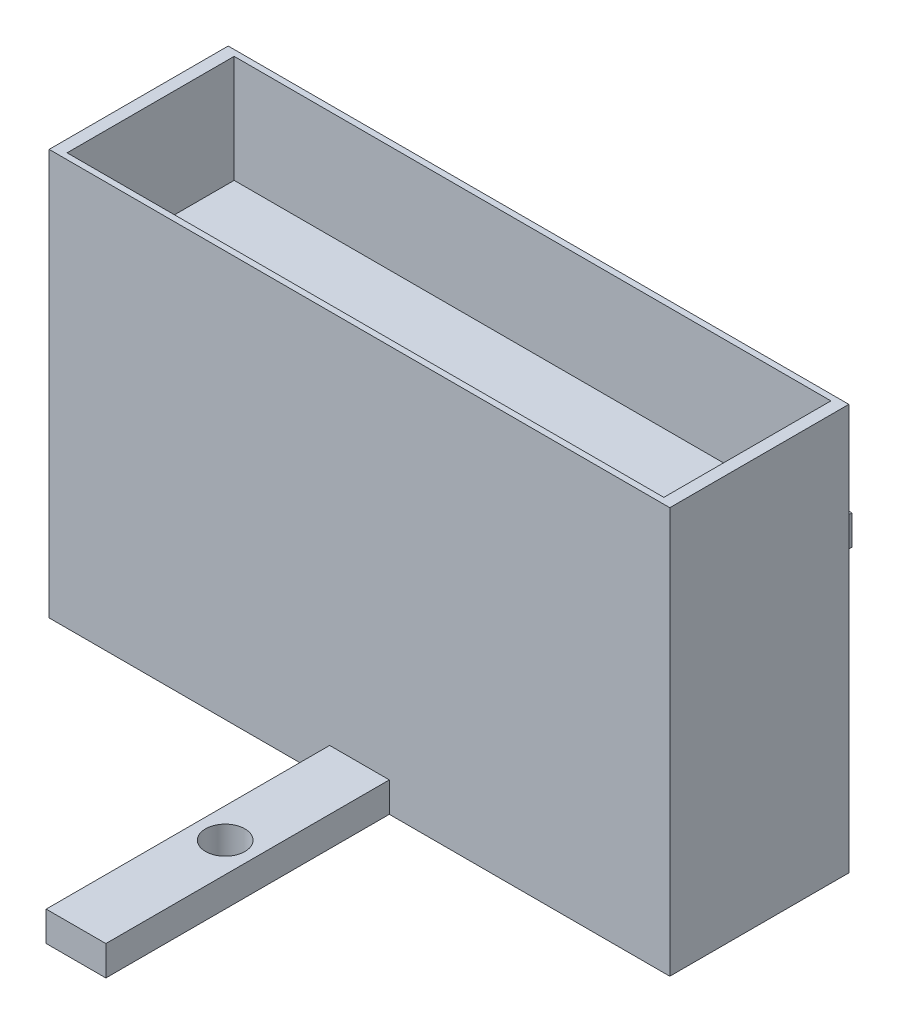
ISO-10303-21;
HEADER;
FILE_DESCRIPTION(('STEP AP214'),'2;1');
FILE_NAME('part.step','',(''),(''),'','','');
FILE_SCHEMA(('AUTOMOTIVE_DESIGN { 1 0 10303 214 1 1 1 1 }'));
ENDSEC;
DATA;
#1=APPLICATION_CONTEXT('core data for automotive mechanical design processes');
#2=APPLICATION_PROTOCOL_DEFINITION('international standard','automotive_design',2000,#1);
#3=PRODUCT_CONTEXT('',#1,'mechanical');
#4=PRODUCT('Part','Part','',(#3));
#5=PRODUCT_RELATED_PRODUCT_CATEGORY('part','',(#4));
#6=PRODUCT_DEFINITION_FORMATION('','',#4);
#7=PRODUCT_DEFINITION_CONTEXT('part definition',#1,'design');
#8=PRODUCT_DEFINITION('design','',#6,#7);
#9=PRODUCT_DEFINITION_SHAPE('','',#8);
#10=(LENGTH_UNIT() NAMED_UNIT(*) SI_UNIT(.MILLI.,.METRE.));
#11=(NAMED_UNIT(*) PLANE_ANGLE_UNIT() SI_UNIT($,.RADIAN.));
#12=(NAMED_UNIT(*) SI_UNIT($,.STERADIAN.) SOLID_ANGLE_UNIT());
#13=UNCERTAINTY_MEASURE_WITH_UNIT(LENGTH_MEASURE(1.E-05),#10,'distance_accuracy_value','');
#14=(GEOMETRIC_REPRESENTATION_CONTEXT(3) GLOBAL_UNCERTAINTY_ASSIGNED_CONTEXT((#13)) GLOBAL_UNIT_ASSIGNED_CONTEXT((#10,
#11,#12)) REPRESENTATION_CONTEXT('',''));
#15=CARTESIAN_POINT('',(0.,0.,0.));
#16=DIRECTION('',(0.,0.,1.));
#17=DIRECTION('',(1.,0.,0.));
#18=AXIS2_PLACEMENT_3D('',#15,#16,#17);
#19=CARTESIAN_POINT('',(-5.,5.,-15.));
#20=DIRECTION('',(-1.,0.,0.));
#21=DIRECTION('',(0.,0.,1.));
#22=AXIS2_PLACEMENT_3D('',#19,#20,#21);
#23=PLANE('',#22);
#24=DIRECTION('',(0.,0.,-1.));
#25=VECTOR('',#24,1.);
#26=CARTESIAN_POINT('',(-5.,0.,-15.));
#27=LINE('',#26,#25);
#28=CARTESIAN_POINT('',(-5.,0.,-15.));
#29=VERTEX_POINT('',#28);
#30=CARTESIAN_POINT('',(-5.,0.,-62.5));
#31=VERTEX_POINT('',#30);
#32=EDGE_CURVE('E113',#29,#31,#27,.T.);
#33=ORIENTED_EDGE('',*,*,#32,.F.);
#34=DIRECTION('',(0.,-1.,0.));
#35=VECTOR('',#34,1.);
#36=CARTESIAN_POINT('',(-5.,5.,-15.));
#37=LINE('',#36,#35);
#38=CARTESIAN_POINT('',(-5.,5.,-15.));
#39=VERTEX_POINT('',#38);
#40=EDGE_CURVE('E12',#39,#29,#37,.T.);
#41=ORIENTED_EDGE('',*,*,#40,.F.);
#42=DIRECTION('',(0.,0.,-1.));
#43=VECTOR('',#42,1.);
#44=CARTESIAN_POINT('',(-5.,5.,-15.));
#45=LINE('',#44,#43);
#46=CARTESIAN_POINT('',(-5.,5.,-62.5));
#47=VERTEX_POINT('',#46);
#48=EDGE_CURVE('E106',#39,#47,#45,.T.);
#49=ORIENTED_EDGE('',*,*,#48,.T.);
#50=DIRECTION('',(0.,-1.,0.));
#51=VECTOR('',#50,1.);
#52=CARTESIAN_POINT('',(-5.,5.,-62.5));
#53=LINE('',#52,#51);
#54=EDGE_CURVE('E51',#47,#31,#53,.T.);
#55=ORIENTED_EDGE('',*,*,#54,.T.);
#56=EDGE_LOOP('',(#33,#41,#49,#55));
#57=FACE_BOUND('',#56,.T.);
#58=ADVANCED_FACE('F48',(#57),#23,.T.);
#59=CARTESIAN_POINT('',(-5.,5.,-15.));
#60=DIRECTION('',(0.,0.,1.));
#61=DIRECTION('',(1.,0.,0.));
#62=AXIS2_PLACEMENT_3D('',#59,#60,#61);
#63=PLANE('',#62);
#64=DIRECTION('',(-1.,0.,0.));
#65=VECTOR('',#64,1.);
#66=CARTESIAN_POINT('',(-5.,0.,-15.));
#67=LINE('',#66,#65);
#68=CARTESIAN_POINT('',(5.,0.,-15.));
#69=VERTEX_POINT('',#68);
#70=EDGE_CURVE('E108',#69,#29,#67,.T.);
#71=ORIENTED_EDGE('',*,*,#70,.F.);
#72=DIRECTION('',(0.,-1.,0.));
#73=VECTOR('',#72,1.);
#74=CARTESIAN_POINT('',(5.,5.,-15.));
#75=LINE('',#74,#73);
#76=CARTESIAN_POINT('',(5.,5.,-15.));
#77=VERTEX_POINT('',#76);
#78=EDGE_CURVE('E57',#77,#69,#75,.T.);
#79=ORIENTED_EDGE('',*,*,#78,.F.);
#80=DIRECTION('',(-1.,0.,0.));
#81=VECTOR('',#80,1.);
#82=CARTESIAN_POINT('',(-5.,5.,-15.));
#83=LINE('',#82,#81);
#84=EDGE_CURVE('E103',#77,#39,#83,.T.);
#85=ORIENTED_EDGE('',*,*,#84,.T.);
#86=ORIENTED_EDGE('',*,*,#40,.T.);
#87=EDGE_LOOP('',(#71,#79,#85,#86));
#88=FACE_BOUND('',#87,.T.);
#89=ADVANCED_FACE('F124',(#88),#63,.T.);
#90=CARTESIAN_POINT('',(5.,5.,-15.));
#91=DIRECTION('',(1.,0.,0.));
#92=DIRECTION('',(0.,0.,-1.));
#93=AXIS2_PLACEMENT_3D('',#90,#91,#92);
#94=PLANE('',#93);
#95=DIRECTION('',(0.,0.,1.));
#96=VECTOR('',#95,1.);
#97=CARTESIAN_POINT('',(5.,0.,-15.));
#98=LINE('',#97,#96);
#99=CARTESIAN_POINT('',(5.,0.,-62.5));
#100=VERTEX_POINT('',#99);
#101=EDGE_CURVE('E98',#100,#69,#98,.T.);
#102=ORIENTED_EDGE('',*,*,#101,.F.);
#103=DIRECTION('',(0.,-1.,0.));
#104=VECTOR('',#103,1.);
#105=CARTESIAN_POINT('',(5.,5.,-62.5));
#106=LINE('',#105,#104);
#107=CARTESIAN_POINT('',(5.,5.,-62.5));
#108=VERTEX_POINT('',#107);
#109=EDGE_CURVE('E93',#108,#100,#106,.T.);
#110=ORIENTED_EDGE('',*,*,#109,.F.);
#111=DIRECTION('',(0.,0.,1.));
#112=VECTOR('',#111,1.);
#113=CARTESIAN_POINT('',(5.,5.,-15.));
#114=LINE('',#113,#112);
#115=EDGE_CURVE('E96',#108,#77,#114,.T.);
#116=ORIENTED_EDGE('',*,*,#115,.T.);
#117=ORIENTED_EDGE('',*,*,#78,.T.);
#118=EDGE_LOOP('',(#102,#110,#116,#117));
#119=FACE_BOUND('',#118,.T.);
#120=ADVANCED_FACE('F95',(#119),#94,.T.);
#121=CARTESIAN_POINT('',(-5.,5.,-62.5));
#122=DIRECTION('',(0.,0.,-1.));
#123=DIRECTION('',(-1.,0.,0.));
#124=AXIS2_PLACEMENT_3D('',#121,#122,#123);
#125=PLANE('',#124);
#126=DIRECTION('',(1.,0.,0.));
#127=VECTOR('',#126,1.);
#128=CARTESIAN_POINT('',(-5.,0.,-62.5));
#129=LINE('',#128,#127);
#130=EDGE_CURVE('E116',#31,#100,#129,.T.);
#131=ORIENTED_EDGE('',*,*,#130,.F.);
#132=ORIENTED_EDGE('',*,*,#54,.F.);
#133=DIRECTION('',(1.,0.,0.));
#134=VECTOR('',#133,1.);
#135=CARTESIAN_POINT('',(-5.,5.,-62.5));
#136=LINE('',#135,#134);
#137=EDGE_CURVE('E102',#47,#108,#136,.T.);
#138=ORIENTED_EDGE('',*,*,#137,.T.);
#139=ORIENTED_EDGE('',*,*,#109,.T.);
#140=EDGE_LOOP('',(#131,#132,#138,#139));
#141=FACE_BOUND('',#140,.T.);
#142=ADVANCED_FACE('F105',(#141),#125,.T.);
#143=CARTESIAN_POINT('',(0.,5.,0.));
#144=DIRECTION('',(0.,-1.,0.));
#145=DIRECTION('',(0.,0.,-1.));
#146=AXIS2_PLACEMENT_3D('',#143,#144,#145);
#147=PLANE('',#146);
#148=CARTESIAN_POINT('',(0.,5.,-37.5));
#149=DIRECTION('',(0.,1.,0.));
#150=DIRECTION('',(0.,0.,1.));
#151=AXIS2_PLACEMENT_3D('',#148,#149,#150);
#152=CIRCLE('',#151,3.29999999999999);
#153=CARTESIAN_POINT('',(0.,5.,-34.2));
#154=VERTEX_POINT('',#153);
#155=EDGE_CURVE('E154',#154,#154,#152,.T.);
#156=ORIENTED_EDGE('',*,*,#155,.F.);
#157=EDGE_LOOP('',(#156));
#158=FACE_BOUND('',#157,.T.);
#159=ORIENTED_EDGE('',*,*,#48,.F.);
#160=ORIENTED_EDGE('',*,*,#84,.F.);
#161=ORIENTED_EDGE('',*,*,#115,.F.);
#162=ORIENTED_EDGE('',*,*,#137,.F.);
#163=EDGE_LOOP('',(#159,#160,#161,#162));
#164=FACE_BOUND('',#163,.T.);
#165=ADVANCED_FACE('F101',(#158,#164),#147,.F.);
#166=CARTESIAN_POINT('',(0.,0.,0.));
#167=DIRECTION('',(0.,-1.,0.));
#168=DIRECTION('',(0.,0.,-1.));
#169=AXIS2_PLACEMENT_3D('',#166,#167,#168);
#170=PLANE('',#169);
#171=CARTESIAN_POINT('',(0.,0.,-37.5));
#172=DIRECTION('',(0.,1.,0.));
#173=DIRECTION('',(0.,0.,1.));
#174=AXIS2_PLACEMENT_3D('',#171,#172,#173);
#175=CIRCLE('',#174,3.3);
#176=CARTESIAN_POINT('',(0.,0.,-34.2));
#177=VERTEX_POINT('',#176);
#178=EDGE_CURVE('E117',#177,#177,#175,.T.);
#179=ORIENTED_EDGE('',*,*,#178,.T.);
#180=EDGE_LOOP('',(#179));
#181=FACE_BOUND('',#180,.T.);
#182=ORIENTED_EDGE('',*,*,#32,.T.);
#183=ORIENTED_EDGE('',*,*,#130,.T.);
#184=ORIENTED_EDGE('',*,*,#101,.T.);
#185=ORIENTED_EDGE('',*,*,#70,.T.);
#186=EDGE_LOOP('',(#182,#183,#184,#185));
#187=FACE_BOUND('',#186,.T.);
#188=ADVANCED_FACE('F123',(#181,#187),#170,.T.);
#189=CARTESIAN_POINT('',(0.,5.,-37.5));
#190=DIRECTION('',(0.,1.,0.));
#191=DIRECTION('',(0.,0.,1.));
#192=AXIS2_PLACEMENT_3D('',#189,#190,#191);
#193=CYLINDRICAL_SURFACE('',#192,3.29999999999999);
#194=ORIENTED_EDGE('',*,*,#178,.F.);
#195=EDGE_LOOP('',(#194));
#196=FACE_BOUND('',#195,.T.);
#197=ORIENTED_EDGE('',*,*,#155,.T.);
#198=EDGE_LOOP('',(#197));
#199=FACE_BOUND('',#198,.T.);
#200=ADVANCED_FACE('F142',(#196,#199),#193,.F.);
#201=CLOSED_SHELL('',(#58,#89,#120,#142,#165,#188,#200));
#202=MANIFOLD_SOLID_BREP('B2',#201);
#203=CARTESIAN_POINT('',(-5.,5.,15.));
#204=DIRECTION('',(-1.,0.,0.));
#205=DIRECTION('',(0.,0.,1.));
#206=AXIS2_PLACEMENT_3D('',#203,#204,#205);
#207=PLANE('',#206);
#208=DIRECTION('',(0.,0.,-1.));
#209=VECTOR('',#208,1.);
#210=CARTESIAN_POINT('',(-5.,0.,15.));
#211=LINE('',#210,#209);
#212=CARTESIAN_POINT('',(-5.,0.,62.5));
#213=VERTEX_POINT('',#212);
#214=CARTESIAN_POINT('',(-5.,0.,15.));
#215=VERTEX_POINT('',#214);
#216=EDGE_CURVE('E281',#213,#215,#211,.T.);
#217=ORIENTED_EDGE('',*,*,#216,.F.);
#218=DIRECTION('',(0.,-1.,0.));
#219=VECTOR('',#218,1.);
#220=CARTESIAN_POINT('',(-5.,5.,62.5));
#221=LINE('',#220,#219);
#222=CARTESIAN_POINT('',(-5.,5.,62.5));
#223=VERTEX_POINT('',#222);
#224=EDGE_CURVE('E46',#223,#213,#221,.T.);
#225=ORIENTED_EDGE('',*,*,#224,.F.);
#226=DIRECTION('',(0.,0.,-1.));
#227=VECTOR('',#226,1.);
#228=CARTESIAN_POINT('',(-5.,5.,15.));
#229=LINE('',#228,#227);
#230=CARTESIAN_POINT('',(-5.,5.,15.));
#231=VERTEX_POINT('',#230);
#232=EDGE_CURVE('E274',#223,#231,#229,.T.);
#233=ORIENTED_EDGE('',*,*,#232,.T.);
#234=DIRECTION('',(0.,-1.,0.));
#235=VECTOR('',#234,1.);
#236=CARTESIAN_POINT('',(-5.,5.,15.));
#237=LINE('',#236,#235);
#238=EDGE_CURVE('E219',#231,#215,#237,.T.);
#239=ORIENTED_EDGE('',*,*,#238,.T.);
#240=EDGE_LOOP('',(#217,#225,#233,#239));
#241=FACE_BOUND('',#240,.T.);
#242=ADVANCED_FACE('F216',(#241),#207,.T.);
#243=CARTESIAN_POINT('',(-5.,5.,62.5));
#244=DIRECTION('',(0.,0.,1.));
#245=DIRECTION('',(1.,0.,0.));
#246=AXIS2_PLACEMENT_3D('',#243,#244,#245);
#247=PLANE('',#246);
#248=DIRECTION('',(-1.,0.,0.));
#249=VECTOR('',#248,1.);
#250=CARTESIAN_POINT('',(-5.,0.,62.5));
#251=LINE('',#250,#249);
#252=CARTESIAN_POINT('',(5.,0.,62.5));
#253=VERTEX_POINT('',#252);
#254=EDGE_CURVE('E276',#253,#213,#251,.T.);
#255=ORIENTED_EDGE('',*,*,#254,.F.);
#256=DIRECTION('',(0.,-1.,0.));
#257=VECTOR('',#256,1.);
#258=CARTESIAN_POINT('',(5.,5.,62.5));
#259=LINE('',#258,#257);
#260=CARTESIAN_POINT('',(5.,5.,62.5));
#261=VERTEX_POINT('',#260);
#262=EDGE_CURVE('E225',#261,#253,#259,.T.);
#263=ORIENTED_EDGE('',*,*,#262,.F.);
#264=DIRECTION('',(-1.,0.,0.));
#265=VECTOR('',#264,1.);
#266=CARTESIAN_POINT('',(-5.,5.,62.5));
#267=LINE('',#266,#265);
#268=EDGE_CURVE('E271',#261,#223,#267,.T.);
#269=ORIENTED_EDGE('',*,*,#268,.T.);
#270=ORIENTED_EDGE('',*,*,#224,.T.);
#271=EDGE_LOOP('',(#255,#263,#269,#270));
#272=FACE_BOUND('',#271,.T.);
#273=ADVANCED_FACE('F292',(#272),#247,.T.);
#274=CARTESIAN_POINT('',(5.00000000000001,5.,15.));
#275=DIRECTION('',(1.,0.,0.));
#276=DIRECTION('',(0.,0.,-1.));
#277=AXIS2_PLACEMENT_3D('',#274,#275,#276);
#278=PLANE('',#277);
#279=DIRECTION('',(0.,0.,1.));
#280=VECTOR('',#279,1.);
#281=CARTESIAN_POINT('',(5.00000000000001,0.,15.));
#282=LINE('',#281,#280);
#283=CARTESIAN_POINT('',(5.00000000000001,0.,15.));
#284=VERTEX_POINT('',#283);
#285=EDGE_CURVE('E266',#284,#253,#282,.T.);
#286=ORIENTED_EDGE('',*,*,#285,.F.);
#287=DIRECTION('',(0.,-1.,0.));
#288=VECTOR('',#287,1.);
#289=CARTESIAN_POINT('',(5.00000000000001,5.,15.));
#290=LINE('',#289,#288);
#291=CARTESIAN_POINT('',(5.00000000000001,5.,15.));
#292=VERTEX_POINT('',#291);
#293=EDGE_CURVE('E261',#292,#284,#290,.T.);
#294=ORIENTED_EDGE('',*,*,#293,.F.);
#295=DIRECTION('',(0.,0.,1.));
#296=VECTOR('',#295,1.);
#297=CARTESIAN_POINT('',(5.00000000000001,5.,15.));
#298=LINE('',#297,#296);
#299=EDGE_CURVE('E264',#292,#261,#298,.T.);
#300=ORIENTED_EDGE('',*,*,#299,.T.);
#301=ORIENTED_EDGE('',*,*,#262,.T.);
#302=EDGE_LOOP('',(#286,#294,#300,#301));
#303=FACE_BOUND('',#302,.T.);
#304=ADVANCED_FACE('F263',(#303),#278,.T.);
#305=CARTESIAN_POINT('',(-5.,5.,15.));
#306=DIRECTION('',(0.,0.,-1.));
#307=DIRECTION('',(-1.,0.,0.));
#308=AXIS2_PLACEMENT_3D('',#305,#306,#307);
#309=PLANE('',#308);
#310=DIRECTION('',(1.,0.,0.));
#311=VECTOR('',#310,1.);
#312=CARTESIAN_POINT('',(-5.,0.,15.));
#313=LINE('',#312,#311);
#314=EDGE_CURVE('E284',#215,#284,#313,.T.);
#315=ORIENTED_EDGE('',*,*,#314,.F.);
#316=ORIENTED_EDGE('',*,*,#238,.F.);
#317=DIRECTION('',(1.,0.,0.));
#318=VECTOR('',#317,1.);
#319=CARTESIAN_POINT('',(-5.,5.,15.));
#320=LINE('',#319,#318);
#321=EDGE_CURVE('E270',#231,#292,#320,.T.);
#322=ORIENTED_EDGE('',*,*,#321,.T.);
#323=ORIENTED_EDGE('',*,*,#293,.T.);
#324=EDGE_LOOP('',(#315,#316,#322,#323));
#325=FACE_BOUND('',#324,.T.);
#326=ADVANCED_FACE('F273',(#325),#309,.T.);
#327=CARTESIAN_POINT('',(0.,5.,0.));
#328=DIRECTION('',(0.,1.,0.));
#329=DIRECTION('',(0.,0.,1.));
#330=AXIS2_PLACEMENT_3D('',#327,#328,#329);
#331=PLANE('',#330);
#332=CARTESIAN_POINT('',(0.,5.,37.5));
#333=DIRECTION('',(0.,1.,0.));
#334=DIRECTION('',(0.,0.,1.));
#335=AXIS2_PLACEMENT_3D('',#332,#333,#334);
#336=CIRCLE('',#335,3.29999999999999);
#337=CARTESIAN_POINT('',(0.,5.,40.8));
#338=VERTEX_POINT('',#337);
#339=EDGE_CURVE('E322',#338,#338,#336,.T.);
#340=ORIENTED_EDGE('',*,*,#339,.F.);
#341=EDGE_LOOP('',(#340));
#342=FACE_BOUND('',#341,.T.);
#343=ORIENTED_EDGE('',*,*,#232,.F.);
#344=ORIENTED_EDGE('',*,*,#268,.F.);
#345=ORIENTED_EDGE('',*,*,#299,.F.);
#346=ORIENTED_EDGE('',*,*,#321,.F.);
#347=EDGE_LOOP('',(#343,#344,#345,#346));
#348=FACE_BOUND('',#347,.T.);
#349=ADVANCED_FACE('F269',(#342,#348),#331,.T.);
#350=CARTESIAN_POINT('',(0.,0.,0.));
#351=DIRECTION('',(0.,1.,0.));
#352=DIRECTION('',(0.,0.,1.));
#353=AXIS2_PLACEMENT_3D('',#350,#351,#352);
#354=PLANE('',#353);
#355=CARTESIAN_POINT('',(0.,0.,37.5));
#356=DIRECTION('',(0.,1.,0.));
#357=DIRECTION('',(0.,0.,1.));
#358=AXIS2_PLACEMENT_3D('',#355,#356,#357);
#359=CIRCLE('',#358,3.3);
#360=CARTESIAN_POINT('',(0.,0.,40.8));
#361=VERTEX_POINT('',#360);
#362=EDGE_CURVE('E285',#361,#361,#359,.T.);
#363=ORIENTED_EDGE('',*,*,#362,.T.);
#364=EDGE_LOOP('',(#363));
#365=FACE_BOUND('',#364,.T.);
#366=ORIENTED_EDGE('',*,*,#216,.T.);
#367=ORIENTED_EDGE('',*,*,#314,.T.);
#368=ORIENTED_EDGE('',*,*,#285,.T.);
#369=ORIENTED_EDGE('',*,*,#254,.T.);
#370=EDGE_LOOP('',(#366,#367,#368,#369));
#371=FACE_BOUND('',#370,.T.);
#372=ADVANCED_FACE('F291',(#365,#371),#354,.F.);
#373=CARTESIAN_POINT('',(0.,5.,37.5));
#374=DIRECTION('',(0.,1.,0.));
#375=DIRECTION('',(0.,0.,1.));
#376=AXIS2_PLACEMENT_3D('',#373,#374,#375);
#377=CYLINDRICAL_SURFACE('',#376,3.29999999999999);
#378=ORIENTED_EDGE('',*,*,#362,.F.);
#379=EDGE_LOOP('',(#378));
#380=FACE_BOUND('',#379,.T.);
#381=ORIENTED_EDGE('',*,*,#339,.T.);
#382=EDGE_LOOP('',(#381));
#383=FACE_BOUND('',#382,.T.);
#384=ADVANCED_FACE('F310',(#380,#383),#377,.F.);
#385=CLOSED_SHELL('',(#242,#273,#304,#326,#349,#372,#384));
#386=MANIFOLD_SOLID_BREP('B6',#385);
#387=CARTESIAN_POINT('',(52.,68.,15.));
#388=DIRECTION('',(-1.,0.,0.));
#389=DIRECTION('',(0.,0.,1.));
#390=AXIS2_PLACEMENT_3D('',#387,#388,#389);
#391=PLANE('',#390);
#392=DIRECTION('',(0.,0.,-1.));
#393=VECTOR('',#392,1.);
#394=CARTESIAN_POINT('',(52.,0.,15.));
#395=LINE('',#394,#393);
#396=CARTESIAN_POINT('',(52.,0.,15.));
#397=VERTEX_POINT('',#396);
#398=CARTESIAN_POINT('',(52.,0.,-15.));
#399=VERTEX_POINT('',#398);
#400=EDGE_CURVE('E483',#397,#399,#395,.T.);
#401=ORIENTED_EDGE('',*,*,#400,.T.);
#402=DIRECTION('',(0.,-1.,0.));
#403=VECTOR('',#402,1.);
#404=CARTESIAN_POINT('',(52.,68.,-15.));
#405=LINE('',#404,#403);
#406=CARTESIAN_POINT('',(52.,68.,-15.));
#407=VERTEX_POINT('',#406);
#408=EDGE_CURVE('E214',#407,#399,#405,.T.);
#409=ORIENTED_EDGE('',*,*,#408,.F.);
#410=DIRECTION('',(0.,0.,-1.));
#411=VECTOR('',#410,1.);
#412=CARTESIAN_POINT('',(52.,68.,15.));
#413=LINE('',#412,#411);
#414=CARTESIAN_POINT('',(52.,68.,15.));
#415=VERTEX_POINT('',#414);
#416=EDGE_CURVE('E487',#415,#407,#413,.T.);
#417=ORIENTED_EDGE('',*,*,#416,.F.);
#418=DIRECTION('',(0.,-1.,0.));
#419=VECTOR('',#418,1.);
#420=CARTESIAN_POINT('',(52.,68.,15.));
#421=LINE('',#420,#419);
#422=EDGE_CURVE('E493',#415,#397,#421,.T.);
#423=ORIENTED_EDGE('',*,*,#422,.T.);
#424=EDGE_LOOP('',(#401,#409,#417,#423));
#425=FACE_BOUND('',#424,.T.);
#426=ADVANCED_FACE('F375',(#425),#391,.F.);
#427=CARTESIAN_POINT('',(-52.,68.,-15.));
#428=DIRECTION('',(0.,0.,1.));
#429=DIRECTION('',(1.,0.,0.));
#430=AXIS2_PLACEMENT_3D('',#427,#428,#429);
#431=PLANE('',#430);
#432=DIRECTION('',(-1.,0.,0.));
#433=VECTOR('',#432,1.);
#434=CARTESIAN_POINT('',(-52.,0.,-15.));
#435=LINE('',#434,#433);
#436=CARTESIAN_POINT('',(-52.,0.,-15.));
#437=VERTEX_POINT('',#436);
#438=EDGE_CURVE('E496',#399,#437,#435,.T.);
#439=ORIENTED_EDGE('',*,*,#438,.T.);
#440=DIRECTION('',(0.,-1.,0.));
#441=VECTOR('',#440,1.);
#442=CARTESIAN_POINT('',(-52.,68.,-15.));
#443=LINE('',#442,#441);
#444=CARTESIAN_POINT('',(-52.,68.,-15.));
#445=VERTEX_POINT('',#444);
#446=EDGE_CURVE('E382',#445,#437,#443,.T.);
#447=ORIENTED_EDGE('',*,*,#446,.F.);
#448=DIRECTION('',(-1.,0.,0.));
#449=VECTOR('',#448,1.);
#450=CARTESIAN_POINT('',(-52.,68.,-15.));
#451=LINE('',#450,#449);
#452=EDGE_CURVE('E426',#407,#445,#451,.T.);
#453=ORIENTED_EDGE('',*,*,#452,.F.);
#454=ORIENTED_EDGE('',*,*,#408,.T.);
#455=EDGE_LOOP('',(#439,#447,#453,#454));
#456=FACE_BOUND('',#455,.T.);
#457=ADVANCED_FACE('F525',(#456),#431,.F.);
#458=CARTESIAN_POINT('',(-52.,68.,15.));
#459=DIRECTION('',(1.,0.,0.));
#460=DIRECTION('',(0.,0.,-1.));
#461=AXIS2_PLACEMENT_3D('',#458,#459,#460);
#462=PLANE('',#461);
#463=DIRECTION('',(0.,0.,1.));
#464=VECTOR('',#463,1.);
#465=CARTESIAN_POINT('',(-52.,0.,15.));
#466=LINE('',#465,#464);
#467=CARTESIAN_POINT('',(-52.,0.,15.));
#468=VERTEX_POINT('',#467);
#469=EDGE_CURVE('E498',#437,#468,#466,.T.);
#470=ORIENTED_EDGE('',*,*,#469,.T.);
#471=DIRECTION('',(0.,-1.,0.));
#472=VECTOR('',#471,1.);
#473=CARTESIAN_POINT('',(-52.,68.,15.));
#474=LINE('',#473,#472);
#475=CARTESIAN_POINT('',(-52.,68.,15.));
#476=VERTEX_POINT('',#475);
#477=EDGE_CURVE('E502',#476,#468,#474,.T.);
#478=ORIENTED_EDGE('',*,*,#477,.F.);
#479=DIRECTION('',(0.,0.,1.));
#480=VECTOR('',#479,1.);
#481=CARTESIAN_POINT('',(-52.,68.,15.));
#482=LINE('',#481,#480);
#483=EDGE_CURVE('E490',#445,#476,#482,.T.);
#484=ORIENTED_EDGE('',*,*,#483,.F.);
#485=ORIENTED_EDGE('',*,*,#446,.T.);
#486=EDGE_LOOP('',(#470,#478,#484,#485));
#487=FACE_BOUND('',#486,.T.);
#488=ADVANCED_FACE('F507',(#487),#462,.F.);
#489=CARTESIAN_POINT('',(-52.,68.,15.));
#490=DIRECTION('',(0.,0.,-1.));
#491=DIRECTION('',(-1.,0.,0.));
#492=AXIS2_PLACEMENT_3D('',#489,#490,#491);
#493=PLANE('',#492);
#494=DIRECTION('',(1.,0.,0.));
#495=VECTOR('',#494,1.);
#496=CARTESIAN_POINT('',(-52.,0.,15.));
#497=LINE('',#496,#495);
#498=EDGE_CURVE('E419',#468,#397,#497,.T.);
#499=ORIENTED_EDGE('',*,*,#498,.T.);
#500=ORIENTED_EDGE('',*,*,#422,.F.);
#501=DIRECTION('',(1.,0.,0.));
#502=VECTOR('',#501,1.);
#503=CARTESIAN_POINT('',(-52.,68.,15.));
#504=LINE('',#503,#502);
#505=EDGE_CURVE('E398',#476,#415,#504,.T.);
#506=ORIENTED_EDGE('',*,*,#505,.F.);
#507=ORIENTED_EDGE('',*,*,#477,.T.);
#508=EDGE_LOOP('',(#499,#500,#506,#507));
#509=FACE_BOUND('',#508,.T.);
#510=ADVANCED_FACE('F515',(#509),#493,.F.);
#511=CARTESIAN_POINT('',(0.,68.,0.));
#512=DIRECTION('',(0.,-1.,0.));
#513=DIRECTION('',(0.,0.,-1.));
#514=AXIS2_PLACEMENT_3D('',#511,#512,#513);
#515=PLANE('',#514);
#516=DIRECTION('',(1.,0.,0.));
#517=VECTOR('',#516,1.);
#518=CARTESIAN_POINT('',(-50.,68.,14.));
#519=LINE('',#518,#517);
#520=CARTESIAN_POINT('',(-50.,68.,14.));
#521=VERTEX_POINT('',#520);
#522=CARTESIAN_POINT('',(50.,68.,14.));
#523=VERTEX_POINT('',#522);
#524=EDGE_CURVE('E477',#521,#523,#519,.T.);
#525=ORIENTED_EDGE('',*,*,#524,.F.);
#526=DIRECTION('',(0.,0.,1.));
#527=VECTOR('',#526,1.);
#528=CARTESIAN_POINT('',(-50.,68.,-14.));
#529=LINE('',#528,#527);
#530=CARTESIAN_POINT('',(-50.,68.,-14.));
#531=VERTEX_POINT('',#530);
#532=EDGE_CURVE('E389',#531,#521,#529,.T.);
#533=ORIENTED_EDGE('',*,*,#532,.F.);
#534=DIRECTION('',(-1.,0.,0.));
#535=VECTOR('',#534,1.);
#536=CARTESIAN_POINT('',(-50.,68.,-14.));
#537=LINE('',#536,#535);
#538=CARTESIAN_POINT('',(50.,68.,-14.));
#539=VERTEX_POINT('',#538);
#540=EDGE_CURVE('E468',#539,#531,#537,.T.);
#541=ORIENTED_EDGE('',*,*,#540,.F.);
#542=DIRECTION('',(0.,0.,-1.));
#543=VECTOR('',#542,1.);
#544=CARTESIAN_POINT('',(50.,68.,-14.));
#545=LINE('',#544,#543);
#546=EDGE_CURVE('E471',#523,#539,#545,.T.);
#547=ORIENTED_EDGE('',*,*,#546,.F.);
#548=EDGE_LOOP('',(#525,#533,#541,#547));
#549=FACE_BOUND('',#548,.T.);
#550=ORIENTED_EDGE('',*,*,#416,.T.);
#551=ORIENTED_EDGE('',*,*,#452,.T.);
#552=ORIENTED_EDGE('',*,*,#483,.T.);
#553=ORIENTED_EDGE('',*,*,#505,.T.);
#554=EDGE_LOOP('',(#550,#551,#552,#553));
#555=FACE_BOUND('',#554,.T.);
#556=ADVANCED_FACE('F517',(#549,#555),#515,.F.);
#557=CARTESIAN_POINT('',(0.,0.,0.));
#558=DIRECTION('',(0.,-1.,0.));
#559=DIRECTION('',(0.,0.,-1.));
#560=AXIS2_PLACEMENT_3D('',#557,#558,#559);
#561=PLANE('',#560);
#562=ORIENTED_EDGE('',*,*,#400,.F.);
#563=ORIENTED_EDGE('',*,*,#498,.F.);
#564=ORIENTED_EDGE('',*,*,#469,.F.);
#565=ORIENTED_EDGE('',*,*,#438,.F.);
#566=EDGE_LOOP('',(#562,#563,#564,#565));
#567=FACE_BOUND('',#566,.T.);
#568=ADVANCED_FACE('F511',(#567),#561,.T.);
#569=CARTESIAN_POINT('',(-50.,50.,-14.));
#570=DIRECTION('',(-1.,0.,0.));
#571=DIRECTION('',(0.,0.,1.));
#572=AXIS2_PLACEMENT_3D('',#569,#570,#571);
#573=PLANE('',#572);
#574=ORIENTED_EDGE('',*,*,#532,.T.);
#575=DIRECTION('',(0.,1.,0.));
#576=VECTOR('',#575,1.);
#577=CARTESIAN_POINT('',(-50.,50.,14.));
#578=LINE('',#577,#576);
#579=CARTESIAN_POINT('',(-50.,50.,14.));
#580=VERTEX_POINT('',#579);
#581=EDGE_CURVE('E446',#580,#521,#578,.T.);
#582=ORIENTED_EDGE('',*,*,#581,.F.);
#583=DIRECTION('',(0.,0.,1.));
#584=VECTOR('',#583,1.);
#585=CARTESIAN_POINT('',(-50.,50.,-14.));
#586=LINE('',#585,#584);
#587=CARTESIAN_POINT('',(-50.,50.,-14.));
#588=VERTEX_POINT('',#587);
#589=EDGE_CURVE('E450',#588,#580,#586,.T.);
#590=ORIENTED_EDGE('',*,*,#589,.F.);
#591=DIRECTION('',(0.,1.,0.));
#592=VECTOR('',#591,1.);
#593=CARTESIAN_POINT('',(-50.,50.,-14.));
#594=LINE('',#593,#592);
#595=EDGE_CURVE('E481',#588,#531,#594,.T.);
#596=ORIENTED_EDGE('',*,*,#595,.T.);
#597=EDGE_LOOP('',(#574,#582,#590,#596));
#598=FACE_BOUND('',#597,.T.);
#599=ADVANCED_FACE('F448',(#598),#573,.F.);
#600=CARTESIAN_POINT('',(-50.,50.,-14.));
#601=DIRECTION('',(0.,0.,-1.));
#602=DIRECTION('',(-1.,0.,0.));
#603=AXIS2_PLACEMENT_3D('',#600,#601,#602);
#604=PLANE('',#603);
#605=ORIENTED_EDGE('',*,*,#540,.T.);
#606=ORIENTED_EDGE('',*,*,#595,.F.);
#607=DIRECTION('',(-1.,0.,0.));
#608=VECTOR('',#607,1.);
#609=CARTESIAN_POINT('',(-50.,50.,-14.));
#610=LINE('',#609,#608);
#611=CARTESIAN_POINT('',(50.,50.,-14.));
#612=VERTEX_POINT('',#611);
#613=EDGE_CURVE('E456',#612,#588,#610,.T.);
#614=ORIENTED_EDGE('',*,*,#613,.F.);
#615=DIRECTION('',(0.,1.,0.));
#616=VECTOR('',#615,1.);
#617=CARTESIAN_POINT('',(50.,50.,-14.));
#618=LINE('',#617,#616);
#619=EDGE_CURVE('E484',#612,#539,#618,.T.);
#620=ORIENTED_EDGE('',*,*,#619,.T.);
#621=EDGE_LOOP('',(#605,#606,#614,#620));
#622=FACE_BOUND('',#621,.T.);
#623=ADVANCED_FACE('F568',(#622),#604,.F.);
#624=CARTESIAN_POINT('',(50.,50.,-14.));
#625=DIRECTION('',(1.,0.,0.));
#626=DIRECTION('',(0.,0.,-1.));
#627=AXIS2_PLACEMENT_3D('',#624,#625,#626);
#628=PLANE('',#627);
#629=ORIENTED_EDGE('',*,*,#546,.T.);
#630=ORIENTED_EDGE('',*,*,#619,.F.);
#631=DIRECTION('',(0.,0.,-1.));
#632=VECTOR('',#631,1.);
#633=CARTESIAN_POINT('',(50.,50.,-14.));
#634=LINE('',#633,#632);
#635=CARTESIAN_POINT('',(50.,50.,14.));
#636=VERTEX_POINT('',#635);
#637=EDGE_CURVE('E464',#636,#612,#634,.T.);
#638=ORIENTED_EDGE('',*,*,#637,.F.);
#639=DIRECTION('',(0.,1.,0.));
#640=VECTOR('',#639,1.);
#641=CARTESIAN_POINT('',(50.,50.,14.));
#642=LINE('',#641,#640);
#643=EDGE_CURVE('E455',#636,#523,#642,.T.);
#644=ORIENTED_EDGE('',*,*,#643,.T.);
#645=EDGE_LOOP('',(#629,#630,#638,#644));
#646=FACE_BOUND('',#645,.T.);
#647=ADVANCED_FACE('F578',(#646),#628,.F.);
#648=CARTESIAN_POINT('',(-50.,50.,14.));
#649=DIRECTION('',(0.,0.,1.));
#650=DIRECTION('',(1.,0.,0.));
#651=AXIS2_PLACEMENT_3D('',#648,#649,#650);
#652=PLANE('',#651);
#653=ORIENTED_EDGE('',*,*,#524,.T.);
#654=ORIENTED_EDGE('',*,*,#643,.F.);
#655=DIRECTION('',(1.,0.,0.));
#656=VECTOR('',#655,1.);
#657=CARTESIAN_POINT('',(-50.,50.,14.));
#658=LINE('',#657,#656);
#659=EDGE_CURVE('E459',#580,#636,#658,.T.);
#660=ORIENTED_EDGE('',*,*,#659,.F.);
#661=ORIENTED_EDGE('',*,*,#581,.T.);
#662=EDGE_LOOP('',(#653,#654,#660,#661));
#663=FACE_BOUND('',#662,.T.);
#664=ADVANCED_FACE('F460',(#663),#652,.F.);
#665=CARTESIAN_POINT('',(0.,50.,0.));
#666=DIRECTION('',(0.,1.,0.));
#667=DIRECTION('',(0.,0.,1.));
#668=AXIS2_PLACEMENT_3D('',#665,#666,#667);
#669=PLANE('',#668);
#670=ORIENTED_EDGE('',*,*,#589,.T.);
#671=ORIENTED_EDGE('',*,*,#659,.T.);
#672=ORIENTED_EDGE('',*,*,#637,.T.);
#673=ORIENTED_EDGE('',*,*,#613,.T.);
#674=EDGE_LOOP('',(#670,#671,#672,#673));
#675=FACE_BOUND('',#674,.T.);
#676=ADVANCED_FACE('F466',(#675),#669,.T.);
#677=CLOSED_SHELL('',(#426,#457,#488,#510,#556,#568,#599,#623,#647,#664,#676));
#678=MANIFOLD_SOLID_BREP('B40',#677);
#679=ADVANCED_BREP_SHAPE_REPRESENTATION('',(#18,#202,#386,#678),#14);
#680=SHAPE_DEFINITION_REPRESENTATION(#9,#679);
ENDSEC;
END-ISO-10303-21;
